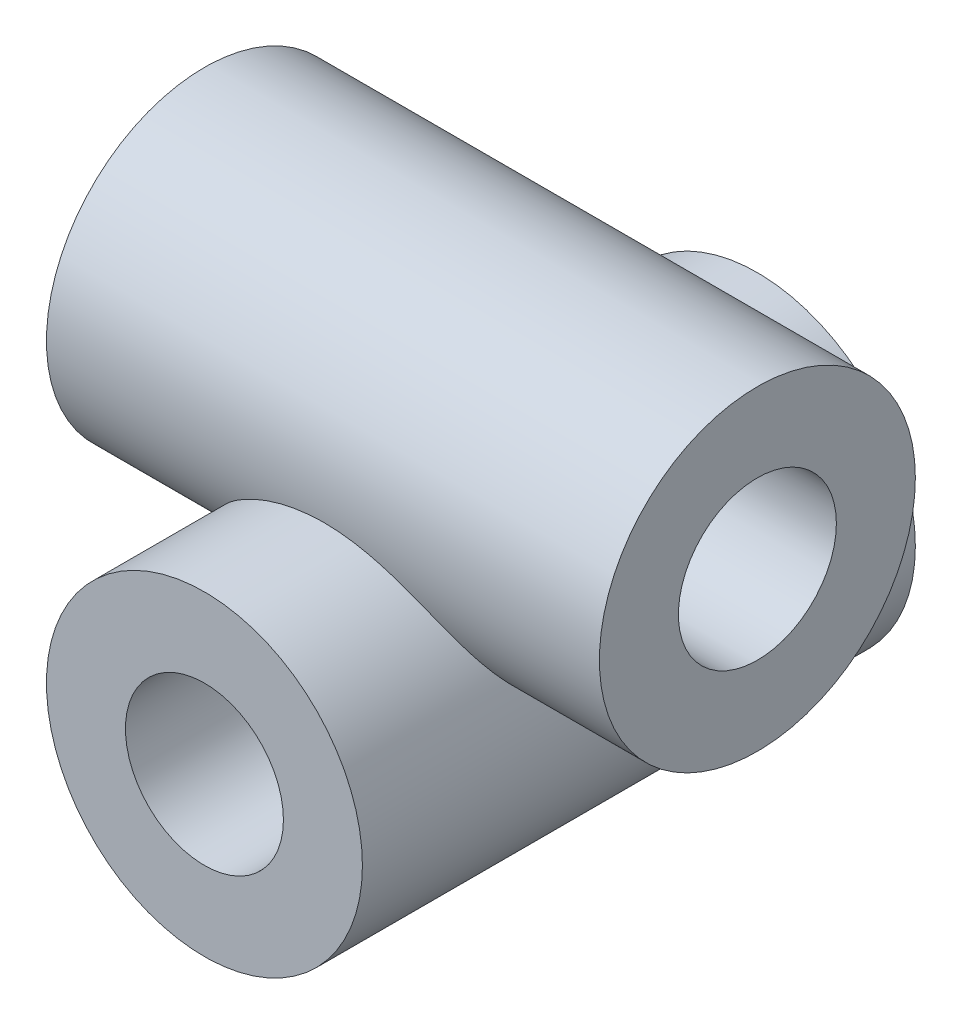
ISO-10303-21;
HEADER;
FILE_DESCRIPTION(('STEP AP214'),'2;1');
FILE_NAME('part.step','',(''),(''),'','','');
FILE_SCHEMA(('AUTOMOTIVE_DESIGN { 1 0 10303 214 1 1 1 1 }'));
ENDSEC;
DATA;
#1=APPLICATION_CONTEXT('core data for automotive mechanical design processes');
#2=APPLICATION_PROTOCOL_DEFINITION('international standard','automotive_design',2000,#1);
#3=PRODUCT_CONTEXT('',#1,'mechanical');
#4=PRODUCT('Part','Part','',(#3));
#5=PRODUCT_RELATED_PRODUCT_CATEGORY('part','',(#4));
#6=PRODUCT_DEFINITION_FORMATION('','',#4);
#7=PRODUCT_DEFINITION_CONTEXT('part definition',#1,'design');
#8=PRODUCT_DEFINITION('design','',#6,#7);
#9=PRODUCT_DEFINITION_SHAPE('','',#8);
#10=(LENGTH_UNIT() NAMED_UNIT(*) SI_UNIT(.MILLI.,.METRE.));
#11=(NAMED_UNIT(*) PLANE_ANGLE_UNIT() SI_UNIT($,.RADIAN.));
#12=(NAMED_UNIT(*) SI_UNIT($,.STERADIAN.) SOLID_ANGLE_UNIT());
#13=UNCERTAINTY_MEASURE_WITH_UNIT(LENGTH_MEASURE(1.E-05),#10,'distance_accuracy_value','');
#14=(GEOMETRIC_REPRESENTATION_CONTEXT(3) GLOBAL_UNCERTAINTY_ASSIGNED_CONTEXT((#13)) GLOBAL_UNIT_ASSIGNED_CONTEXT((#10,
#11,#12)) REPRESENTATION_CONTEXT('',''));
#15=CARTESIAN_POINT('',(0.,0.,0.));
#16=DIRECTION('',(0.,0.,1.));
#17=DIRECTION('',(1.,0.,0.));
#18=AXIS2_PLACEMENT_3D('',#15,#16,#17);
#19=CARTESIAN_POINT('',(0.,0.,56.));
#20=DIRECTION('',(0.,0.,-1.));
#21=DIRECTION('',(-1.,0.,0.));
#22=AXIS2_PLACEMENT_3D('',#19,#20,#21);
#23=CYLINDRICAL_SURFACE('',#22,16.);
#24=CARTESIAN_POINT('',(0.,0.,56.));
#25=DIRECTION('',(0.,0.,1.));
#26=DIRECTION('',(1.,0.,0.));
#27=AXIS2_PLACEMENT_3D('',#24,#25,#26);
#28=CIRCLE('',#27,16.);
#29=CARTESIAN_POINT('',(16.,0.,56.));
#30=VERTEX_POINT('',#29);
#31=EDGE_CURVE('E41',#30,#30,#28,.T.);
#32=ORIENTED_EDGE('',*,*,#31,.F.);
#33=EDGE_LOOP('',(#32));
#34=FACE_BOUND('',#33,.T.);
#35=CARTESIAN_POINT('',(0.,0.,0.));
#36=DIRECTION('',(0.,0.,1.));
#37=DIRECTION('',(1.,0.,0.));
#38=AXIS2_PLACEMENT_3D('',#35,#36,#37);
#39=CIRCLE('',#38,16.);
#40=CARTESIAN_POINT('',(16.,0.,0.));
#41=VERTEX_POINT('',#40);
#42=EDGE_CURVE('E37',#41,#41,#39,.T.);
#43=ORIENTED_EDGE('',*,*,#42,.T.);
#44=EDGE_LOOP('',(#43));
#45=FACE_BOUND('',#44,.T.);
#46=CARTESIAN_POINT('',(0.,16.,43.8745078663875));
#47=CARTESIAN_POINT('',(0.436646655831672,15.9999981450568,43.87451060128));
#48=CARTESIAN_POINT('',(0.873339937822835,15.9821122939766,43.8722857239636));
#49=CARTESIAN_POINT('',(1.74391300438998,15.9106766574318,43.8630387172813));
#50=CARTESIAN_POINT('',(2.1777915119281,15.8571116908978,43.856014545836));
#51=CARTESIAN_POINT('',(3.04044936169511,15.7145522319213,43.8360955072419));
#52=CARTESIAN_POINT('',(3.46921688873031,15.6254877067201,43.8231890283408));
#53=CARTESIAN_POINT('',(4.31769730161077,15.4126173803366,43.7897766483459));
#54=CARTESIAN_POINT('',(4.73741114624135,15.2888152775091,43.7692715561681));
#55=CARTESIAN_POINT('',(5.56544378560812,15.0072435536613,43.7182665369156));
#56=CARTESIAN_POINT('',(5.97374298633112,14.8494191445544,43.6877504466988));
#57=CARTESIAN_POINT('',(6.77511037402526,14.5013344742994,43.6138073830064));
#58=CARTESIAN_POINT('',(7.16817794313895,14.3110728990537,43.5703798864096));
#59=CARTESIAN_POINT('',(7.93554267804045,13.9002302178081,43.4672779009519));
#60=CARTESIAN_POINT('',(8.3098543753323,13.6796730955919,43.4076162277539));
#61=CARTESIAN_POINT('',(9.03674921374844,13.2107591049879,43.2683641891569));
#62=CARTESIAN_POINT('',(9.38933416562267,12.9624045581644,43.1887754873228));
#63=CARTESIAN_POINT('',(10.0528073959647,12.4541958217915,43.0104271721849));
#64=CARTESIAN_POINT('',(10.3648937091361,12.1955087949687,42.912803576111));
#65=CARTESIAN_POINT('',(10.9638931121697,11.6599487092304,42.6931094750389));
#66=CARTESIAN_POINT('',(11.2508070558025,11.3830762676665,42.5710397996391));
#67=CARTESIAN_POINT('',(11.7969026511473,10.8160921274116,42.3000018721725));
#68=CARTESIAN_POINT('',(12.0561138447713,10.5259950121419,42.1510627385105));
#69=CARTESIAN_POINT('',(12.5454778742449,9.9376724235896,41.8243259190733));
#70=CARTESIAN_POINT('',(12.7756347102398,9.63944807613714,41.6465322136578));
#71=CARTESIAN_POINT('',(13.1788486026048,9.0786431920136,41.2855609971855));
#72=CARTESIAN_POINT('',(13.3554457428193,8.81632636237079,41.1059101284296));
#73=CARTESIAN_POINT('',(13.6859575653867,8.29397775916651,40.7239057754772));
#74=CARTESIAN_POINT('',(13.839874384211,8.03394577254711,40.5215544328174));
#75=CARTESIAN_POINT('',(14.125717575625,7.52001405601283,40.0946890115435));
#76=CARTESIAN_POINT('',(14.2576408433101,7.26611519625147,39.8701718108112));
#77=CARTESIAN_POINT('',(14.5006857862906,6.76808052288624,39.4000547092856));
#78=CARTESIAN_POINT('',(14.6118069605679,6.52394494454218,39.1544543009114));
#79=CARTESIAN_POINT('',(14.8118831139296,6.05566232416701,38.6511713286615));
#80=CARTESIAN_POINT('',(14.9013961726745,5.8311377650922,38.3940604216902));
#81=CARTESIAN_POINT('',(15.0641495812513,5.39677689764267,37.8628837714219));
#82=CARTESIAN_POINT('',(15.1373904501377,5.18694012089956,37.5888185692939));
#83=CARTESIAN_POINT('',(15.2695378271367,4.78395315664064,37.0253051877943));
#84=CARTESIAN_POINT('',(15.3284406316533,4.59080728876506,36.7358530573741));
#85=CARTESIAN_POINT('',(15.4338453926477,4.22291828910071,36.1433199984377));
#86=CARTESIAN_POINT('',(15.4803465352645,4.0481763655289,35.8402381769952));
#87=CARTESIAN_POINT('',(15.5672264116919,3.70092325091184,35.1893328565796));
#88=CARTESIAN_POINT('',(15.6064314935216,3.5306173008468,34.8401748454151));
#89=CARTESIAN_POINT('',(15.6743802502868,3.21555321689966,34.1295383598659));
#90=CARTESIAN_POINT('',(15.7031233441342,3.07079650232343,33.7680592023496));
#91=CARTESIAN_POINT('',(15.7522682173134,2.80783783958764,33.0348723863692));
#92=CARTESIAN_POINT('',(15.772666915627,2.6896457071672,32.663161003809));
#93=CARTESIAN_POINT('',(15.8068816499578,2.48066495985011,31.9118174587815));
#94=CARTESIAN_POINT('',(15.8206974114626,2.38987748780168,31.5321849666883));
#95=CARTESIAN_POINT('',(15.8443302515743,2.22814155118249,30.7266463728995));
#96=CARTESIAN_POINT('',(15.8535695102535,2.16030891990455,30.300094537067));
#97=CARTESIAN_POINT('',(15.8670004017268,2.05934088338785,29.4428109357382));
#98=CARTESIAN_POINT('',(15.8711916969471,2.02620779864045,29.0120788926393));
#99=CARTESIAN_POINT('',(15.8751612156748,1.99487125428519,28.1492199781481));
#100=CARTESIAN_POINT('',(15.8749383868864,1.99667612363507,27.7170927987142));
#101=CARTESIAN_POINT('',(15.8700420911309,2.03522348456923,26.8544264208297));
#102=CARTESIAN_POINT('',(15.8653686070605,2.07196611041473,26.423887228488));
#103=CARTESIAN_POINT('',(15.850634357518,2.18187449232417,25.5534823815164));
#104=CARTESIAN_POINT('',(15.8404051578899,2.25617370039567,25.1137621259894));
#105=CARTESIAN_POINT('',(15.8129535360227,2.44115356050731,24.2422421343094));
#106=CARTESIAN_POINT('',(15.7957308601555,2.55183553199012,23.8104426860088));
#107=CARTESIAN_POINT('',(15.752081756531,2.80871660515413,22.9578600325911));
#108=CARTESIAN_POINT('',(15.7256525752656,2.9549263286164,22.5370801637675));
#109=CARTESIAN_POINT('',(15.6607530142861,3.28154255805836,21.7099535864809));
#110=CARTESIAN_POINT('',(15.6222829727171,3.46194810365623,21.3036064730577));
#111=CARTESIAN_POINT('',(15.5306812806288,3.85193116776029,20.5151901004929));
#112=CARTESIAN_POINT('',(15.4777995604427,4.06098365419844,20.1328325731022));
#113=CARTESIAN_POINT('',(15.3535321211969,4.5080878674766,19.3885703137686));
#114=CARTESIAN_POINT('',(15.2821463161611,4.74613972905453,19.026665676866));
#115=CARTESIAN_POINT('',(15.1172054003376,5.24782922147056,18.3269848322751));
#116=CARTESIAN_POINT('',(15.0236751587111,5.51143795612907,17.989182106943));
#117=CARTESIAN_POINT('',(14.8107487117206,6.06038784683204,17.3404452445631));
#118=CARTESIAN_POINT('',(14.6913563963013,6.34572573038905,17.0295070766141));
#119=CARTESIAN_POINT('',(14.4368736173931,6.90369913680767,16.4668699084627));
#120=CARTESIAN_POINT('',(14.3045418358133,7.17475718224196,16.2123560014215));
#121=CARTESIAN_POINT('',(14.0144942201527,7.72598766105747,15.7289359733934));
#122=CARTESIAN_POINT('',(13.8567802869932,8.00615941064196,15.5000279369047));
#123=CARTESIAN_POINT('',(13.5149368635793,8.57060445599358,15.0689300452658));
#124=CARTESIAN_POINT('',(13.330822494285,8.85487532071525,14.8667250223398));
#125=CARTESIAN_POINT('',(12.9357886954146,9.42257353409345,14.4891165009158));
#126=CARTESIAN_POINT('',(12.7248710100599,9.706000936411,14.3137112600605));
#127=CARTESIAN_POINT('',(12.3009196268937,10.2366991468104,14.0066152942495));
#128=CARTESIAN_POINT('',(12.0905659062241,10.4845735358829,13.8722503978899));
#129=CARTESIAN_POINT('',(11.649774355007,10.9722725577425,13.6234223085142));
#130=CARTESIAN_POINT('',(11.4193382487188,11.2120978791726,13.5089574094209));
#131=CARTESIAN_POINT('',(10.9395032447552,11.6807439515022,13.2985366216907));
#132=CARTESIAN_POINT('',(10.6900994787266,11.9095618524014,13.202585507417));
#133=CARTESIAN_POINT('',(10.1738162948547,12.3535174780338,13.0275523295445));
#134=CARTESIAN_POINT('',(9.90693591168228,12.5686544457983,12.9484711987961));
#135=CARTESIAN_POINT('',(9.34735179378671,12.9905427288822,12.8027321199512));
#136=CARTESIAN_POINT('',(9.05406293983352,13.1967083949333,12.73662764678));
#137=CARTESIAN_POINT('',(8.45231241138395,13.589982741951,12.6183900592343));
#138=CARTESIAN_POINT('',(8.14385056416605,13.7770912059058,12.5662571039479));
#139=CARTESIAN_POINT('',(7.51352680005699,14.1307308891964,12.4738227287313));
#140=CARTESIAN_POINT('',(7.1916605122006,14.2972553250627,12.4335252031803));
#141=CARTESIAN_POINT('',(6.53647473365452,14.6084240939546,12.3627792545478));
#142=CARTESIAN_POINT('',(6.20315455680483,14.7530671133316,12.3323314226668));
#143=CARTESIAN_POINT('',(5.48509900982256,15.0359700900744,12.276201084786));
#144=CARTESIAN_POINT('',(5.0990982777922,15.1712348834967,12.251571705792));
#145=CARTESIAN_POINT('',(4.31747733994313,15.4118994169711,12.2102361139622));
#146=CARTESIAN_POINT('',(3.92185647226948,15.5172970958498,12.1935304479));
#147=CARTESIAN_POINT('',(3.12338265219243,15.6975167861793,12.166273695836));
#148=CARTESIAN_POINT('',(2.72052761981208,15.7723298520568,12.1557244101046));
#149=CARTESIAN_POINT('',(1.91017133944952,15.8908447700439,12.1395133980522));
#150=CARTESIAN_POINT('',(1.50266997757427,15.9345458578487,12.1338517918024));
#151=CARTESIAN_POINT('',(0.654509941989936,15.9926765893595,12.1263861856574));
#152=CARTESIAN_POINT('',(0.213677290581165,16.0046388897207,12.1249067904372));
#153=CARTESIAN_POINT('',(-0.667479838106356,15.992143186763,12.126483062672));
#154=CARTESIAN_POINT('',(-1.10780428574805,15.9676831571439,12.1295389824423));
#155=CARTESIAN_POINT('',(-1.98501768638697,15.8825044759494,12.1406791506835));
#156=CARTESIAN_POINT('',(-2.4219054799282,15.8217740778603,12.1487650281906));
#157=CARTESIAN_POINT('',(-3.28902589454549,15.664496943588,12.1711741967825));
#158=CARTESIAN_POINT('',(-3.71925855161752,15.567950401196,12.1854974541185));
#159=CARTESIAN_POINT('',(-4.57458435701518,15.3385568770787,12.2224729596714));
#160=CARTESIAN_POINT('',(-4.99957164918223,15.2053287157411,12.2452135831571));
#161=CARTESIAN_POINT('',(-5.83635931918789,14.9041814105971,12.3016128241833));
#162=CARTESIAN_POINT('',(-6.24815935383457,14.7362613647974,12.3352717256133));
#163=CARTESIAN_POINT('',(-7.05518903440648,14.3673624951188,12.4166883976125));
#164=CARTESIAN_POINT('',(-7.45042100114651,14.1663883209309,12.4644441859367));
#165=CARTESIAN_POINT('',(-8.22096182742892,13.733571540122,12.5776917118644));
#166=CARTESIAN_POINT('',(-8.59627204766777,13.5017310455388,12.6431822362796));
#167=CARTESIAN_POINT('',(-9.30710171218765,13.0212703144643,12.792350879858));
#168=CARTESIAN_POINT('',(-9.64365284388474,12.7738816552664,12.8750734562981));
#169=CARTESIAN_POINT('',(-10.2925358155617,12.2570668233264,13.0636572967153));
#170=CARTESIAN_POINT('',(-10.6048683343236,11.9876412686539,13.1695179118781));
#171=CARTESIAN_POINT('',(-11.2022004482436,11.4314054970644,13.4073684529354));
#172=CARTESIAN_POINT('',(-11.487235462978,11.1446186183924,13.5393238189204));
#173=CARTESIAN_POINT('',(-12.0281544207851,10.5585249015123,13.8320210450163));
#174=CARTESIAN_POINT('',(-12.2840429145775,10.2592200277746,13.9927584012152));
#175=CARTESIAN_POINT('',(-12.7350929307813,9.69184872254098,14.3227024031453));
#176=CARTESIAN_POINT('',(-12.9338471474307,9.42455304081407,14.4883400761428));
#177=CARTESIAN_POINT('',(-13.307508954996,8.88913664519337,14.8434311208173));
#178=CARTESIAN_POINT('',(-13.4824187454324,8.62101600973346,15.0328822927237));
#179=CARTESIAN_POINT('',(-13.8086346524407,8.08821510469549,15.4354464771453));
#180=CARTESIAN_POINT('',(-13.9599404898363,7.82353487584285,15.6485597694736));
#181=CARTESIAN_POINT('',(-14.2398281164356,7.30171059570131,16.0976853999613));
#182=CARTESIAN_POINT('',(-14.3684098543635,7.04456656141858,16.3336977897896));
#183=CARTESIAN_POINT('',(-14.5974461084125,6.55614823229788,16.8130215965055));
#184=CARTESIAN_POINT('',(-14.6990990478275,6.32423840354211,17.0551167908043));
#185=CARTESIAN_POINT('',(-14.8850771334924,5.87315966639124,17.5571263993029));
#186=CARTESIAN_POINT('',(-14.9694031740029,5.6539901008758,17.8170398929564));
#187=CARTESIAN_POINT('',(-15.1225340201443,5.23064659108243,18.3532216842114));
#188=CARTESIAN_POINT('',(-15.1913350549857,5.02647629800537,18.6294939345824));
#189=CARTESIAN_POINT('',(-15.3152904462865,4.63508674994955,19.196713425285));
#190=CARTESIAN_POINT('',(-15.3704439084643,4.4478686063001,19.4876616257815));
#191=CARTESIAN_POINT('',(-15.4734326243404,4.07595441761337,20.1092696471029));
#192=CARTESIAN_POINT('',(-15.5201668855584,3.89299261415764,20.4411500390047));
#193=CARTESIAN_POINT('',(-15.6020560090313,3.5506114931177,21.1182040744349));
#194=CARTESIAN_POINT('',(-15.6372103500493,3.39119323545665,21.4633783155669));
#195=CARTESIAN_POINT('',(-15.6981169844818,3.09704696114638,22.1650400019136));
#196=CARTESIAN_POINT('',(-15.7238657075505,2.96232833005045,22.5215316875023));
#197=CARTESIAN_POINT('',(-15.7678388737732,2.7185644309802,23.2436387470133));
#198=CARTESIAN_POINT('',(-15.78606295233,2.60952040714702,23.6092545621241));
#199=CARTESIAN_POINT('',(-15.8183308279758,2.40669627332995,24.3903010154513));
#200=CARTESIAN_POINT('',(-15.8316473604171,2.31614022529892,24.8066023672372));
#201=CARTESIAN_POINT('',(-15.8525447283487,2.16849707172676,25.645252563975));
#202=CARTESIAN_POINT('',(-15.860125163586,2.1114123018049,26.067601828843));
#203=CARTESIAN_POINT('',(-15.8706101893124,2.03110311371539,26.915665508904));
#204=CARTESIAN_POINT('',(-15.873513698082,2.00788652898867,27.3413806797192));
#205=CARTESIAN_POINT('',(-15.875075613052,1.99549663441731,28.1933118816999));
#206=CARTESIAN_POINT('',(-15.873733980635,2.0063236342638,28.6195279173863));
#207=CARTESIAN_POINT('',(-15.8664476499879,2.06318167692007,29.4885191007732));
#208=CARTESIAN_POINT('',(-15.8603020076335,2.11074842398909,29.9311929717509));
#209=CARTESIAN_POINT('',(-15.8421991201439,2.24257470265513,30.8109418717657));
#210=CARTESIAN_POINT('',(-15.8302416314775,2.32683577182302,31.2480166653994));
#211=CARTESIAN_POINT('',(-15.7988149816324,2.53143323792076,32.1135450548515));
#212=CARTESIAN_POINT('',(-15.7793430743765,2.65178281948626,32.5419954386613));
#213=CARTESIAN_POINT('',(-15.7305138887982,2.92754636635087,33.3868910657287));
#214=CARTESIAN_POINT('',(-15.7011567889229,3.08295969866384,33.8033365255514));
#215=CARTESIAN_POINT('',(-15.6298271324997,3.42622214745243,34.6180826587344));
#216=CARTESIAN_POINT('',(-15.5879445510947,3.6138359911697,35.0164901555992));
#217=CARTESIAN_POINT('',(-15.4880841388875,4.02032675686084,35.7949674699694));
#218=CARTESIAN_POINT('',(-15.4301060827878,4.23920411642704,36.1750370307007));
#219=CARTESIAN_POINT('',(-15.2943743757994,4.70542000332215,36.9131646347028));
#220=CARTESIAN_POINT('',(-15.2166375784129,4.95273417709949,37.2712411156972));
#221=CARTESIAN_POINT('',(-15.0375237460759,5.47251031021859,37.962372182099));
#222=CARTESIAN_POINT('',(-14.936149743126,5.74496904150215,38.2954299694752));
#223=CARTESIAN_POINT('',(-14.7156996938472,6.28700824990399,38.9068137446888));
#224=CARTESIAN_POINT('',(-14.5988010076492,6.55493871481398,39.1873878540123));
#225=CARTESIAN_POINT('',(-14.3396511163952,7.10397737289489,39.7227838963481));
#226=CARTESIAN_POINT('',(-14.1974015090548,7.38508473478327,39.9776074506773));
#227=CARTESIAN_POINT('',(-13.885882904895,7.95535647979188,40.4597130009644));
#228=CARTESIAN_POINT('',(-13.7166371048022,8.24451377143069,40.6870183498836));
#229=CARTESIAN_POINT('',(-13.3500569678422,8.82575488590907,41.1134713997988));
#230=CARTESIAN_POINT('',(-13.1527254117055,9.11783841636771,41.3126218844811));
#231=CARTESIAN_POINT('',(-12.7554545969231,9.66428271583181,41.6604452816899));
#232=CARTESIAN_POINT('',(-12.5587038776436,9.91894208024667,41.8123094658388));
#233=CARTESIAN_POINT('',(-12.1439693478095,10.4225902003746,42.0949008692633));
#234=CARTESIAN_POINT('',(-11.9259875140356,10.6715794813579,42.2256300533618));
#235=CARTESIAN_POINT('',(-11.4697113195584,11.1605362222196,42.4670703175621));
#236=CARTESIAN_POINT('',(-11.2314137634853,11.400502254286,42.5777782400297));
#237=CARTESIAN_POINT('',(-10.7358398187783,11.8683561202445,42.7806623337749));
#238=CARTESIAN_POINT('',(-10.4785626157445,12.0962434351276,42.8728377092042));
#239=CARTESIAN_POINT('',(-9.94465743393545,12.5389364756967,43.0410531706405));
#240=CARTESIAN_POINT('',(-9.6679025627773,12.753635253112,43.116971293908));
#241=CARTESIAN_POINT('',(-9.09844449120506,13.1659368546495,43.2538201596297));
#242=CARTESIAN_POINT('',(-8.80574131244119,13.3635397019787,43.314750922429));
#243=CARTESIAN_POINT('',(-8.2059543829789,13.740006369344,43.4237120769396));
#244=CARTESIAN_POINT('',(-7.89886080811711,13.9188571096996,43.4717335003633));
#245=CARTESIAN_POINT('',(-7.27226488576006,14.2562550494877,43.5568199670567));
#246=CARTESIAN_POINT('',(-6.95276203702778,14.41480142767,43.5938845672351));
#247=CARTESIAN_POINT('',(-6.26415393144148,14.728207279462,43.6628268227692));
#248=CARTESIAN_POINT('',(-5.8936931662565,14.8803475228165,43.6935504290752));
#249=CARTESIAN_POINT('',(-5.14179808513323,15.156595278567,43.7459462089044));
#250=CARTESIAN_POINT('',(-4.76036199983436,15.2806982421292,43.7676169141475));
#251=CARTESIAN_POINT('',(-3.98942888115777,15.4998339133845,43.8038441770183));
#252=CARTESIAN_POINT('',(-3.59994260468994,15.5949030351939,43.8184096598011));
#253=CARTESIAN_POINT('',(-2.81490308704768,15.7555316472356,43.842000039879));
#254=CARTESIAN_POINT('',(-2.41935202773844,15.8211015039534,43.8510268839415));
#255=CARTESIAN_POINT('',(-1.68672773573456,15.914431358938,43.8635501642189));
#256=CARTESIAN_POINT('',(-1.35020815305262,15.9465072636627,43.8676917440905));
#257=CARTESIAN_POINT('',(-0.675801675348916,15.9892921497695,43.8731695169463));
#258=CARTESIAN_POINT('',(-0.337914799872669,16.0000014355149,43.8745057498921));
#259=CARTESIAN_POINT('',(0.,16.,43.8745078663875));
#260=B_SPLINE_CURVE_WITH_KNOTS('',3,(#46,#47,#48,#49,#50,#51,#52,#53,#54,#55,#56,#57,#58,#59,
#60,#61,#62,#63,#64,#65,#66,#67,#68,#69,#70,#71,#72,#73,#74,#75,#76,#77,#78,#79,#80,#81,#82,#83,
#84,#85,#86,#87,#88,#89,#90,#91,#92,#93,#94,#95,#96,#97,#98,#99,#100,#101,#102,#103,#104,#105,
#106,#107,#108,#109,#110,#111,#112,#113,#114,#115,#116,#117,#118,#119,#120,#121,#122,#123,#124,
#125,#126,#127,#128,#129,#130,#131,#132,#133,#134,#135,#136,#137,#138,#139,#140,#141,#142,#143,
#144,#145,#146,#147,#148,#149,#150,#151,#152,#153,#154,#155,#156,#157,#158,#159,#160,#161,#162,
#163,#164,#165,#166,#167,#168,#169,#170,#171,#172,#173,#174,#175,#176,#177,#178,#179,#180,#181,
#182,#183,#184,#185,#186,#187,#188,#189,#190,#191,#192,#193,#194,#195,#196,#197,#198,#199,#200,
#201,#202,#203,#204,#205,#206,#207,#208,#209,#210,#211,#212,#213,#214,#215,#216,#217,#218,#219,
#220,#221,#222,#223,#224,#225,#226,#227,#228,#229,#230,#231,#232,#233,#234,#235,#236,#237,#238,
#239,#240,#241,#242,#243,#244,#245,#246,#247,#248,#249,#250,#251,#252,#253,#254,#255,#256,#257,
#258,#259),.UNSPECIFIED.,.T.,.F.,(4,2,2,2,2,2,2,2,2,2,2,2,2,2,2,2,2,2,2,2,2,2,2,2,2,2,2,2,2,2,2,
2,2,2,2,2,2,2,2,2,2,2,2,2,2,2,2,2,2,2,2,2,2,2,2,2,2,2,2,2,2,2,2,2,2,2,2,2,2,2,2,2,2,2,2,2,2,2,2,
2,2,2,2,2,2,2,2,2,2,2,2,2,2,2,2,2,2,2,2,2,2,2,2,2,2,2,4),(0.,1.30964894631869,2.61985549005877,
3.93265967639963,5.24532414733715,6.56011848279083,7.87496609598381,9.18877873211194,
10.5024817239902,11.751543095352,13.00056208594,14.2482355590821,15.4957370672791,
16.5854174595803,17.674995138999,18.7647265077995,19.8544841193858,20.9120324155339,
21.9695469728891,23.0273344025383,24.0851912325888,25.2553257856956,26.4255253214303,
27.5961565431699,28.7668365766448,30.0613932647291,31.3560365192418,32.6509884112233,
33.9459452795555,35.2825512219024,36.6192056424115,37.9562601770893,39.2932771664599,
40.6084398810986,41.9236087065249,43.2373074882833,44.5508088121072,45.7331278727098,
46.9153584281845,48.0969145409683,49.2783938035126,50.3324889892842,51.386493760198,
52.4407699772694,53.4951044769872,54.5876131260433,55.6801342145327,56.7730143890148,
57.8659601484253,59.0939035067502,60.3219315866197,61.5503185910591,62.7787357713186,
64.1001806323347,65.4216990126481,66.7436456118778,68.0655850585244,69.4018167538122,
70.7380831956632,72.0741618267693,73.4101490832052,74.6857683541999,75.9613518601127,
77.2352571617802,78.5089632919761,79.6234878259548,80.7379094813553,81.8523443166007,
82.9667816664848,84.0166159377339,85.0663960122456,86.1164307887045,87.1665343523598,
88.3108797515073,89.4552766530372,90.6001075140561,91.7449938399219,93.0222957410719,
94.2996867614961,95.5773731854507,96.8550712324267,98.1892747835834,99.5235342461132,
100.858281764294,102.193005188957,103.518362143181,104.843737650113,106.167986430655,
107.492065440012,108.705873287385,109.919604662819,111.132298691467,112.344872736438,
113.411114029654,114.477256142296,115.543566254166,116.609922147109,117.684017476731,
118.758111348279,119.832949489822,120.907831091611,122.111537021304,123.315438103047,
124.51782299703,125.719785024189,126.733318644234,127.746837826594),.UNSPECIFIED.);
#261=CARTESIAN_POINT('',(0.,16.,43.8745078663875));
#262=VERTEX_POINT('',#261);
#263=EDGE_CURVE('E10',#262,#262,#260,.T.);
#264=ORIENTED_EDGE('',*,*,#263,.F.);
#265=EDGE_LOOP('',(#264));
#266=FACE_BOUND('',#265,.T.);
#267=ADVANCED_FACE('F33',(#34,#45,#266),#23,.T.);
#268=CARTESIAN_POINT('',(0.,0.,56.));
#269=DIRECTION('',(0.,0.,-1.));
#270=DIRECTION('',(-1.,0.,0.));
#271=AXIS2_PLACEMENT_3D('',#268,#269,#270);
#272=CYLINDRICAL_SURFACE('',#271,8.);
#273=CARTESIAN_POINT('',(0.,0.,0.));
#274=DIRECTION('',(0.,0.,1.));
#275=DIRECTION('',(1.,0.,0.));
#276=AXIS2_PLACEMENT_3D('',#273,#274,#275);
#277=CIRCLE('',#276,8.);
#278=CARTESIAN_POINT('',(8.,0.,0.));
#279=VERTEX_POINT('',#278);
#280=EDGE_CURVE('E92',#279,#279,#277,.T.);
#281=ORIENTED_EDGE('',*,*,#280,.F.);
#282=EDGE_LOOP('',(#281));
#283=FACE_BOUND('',#282,.T.);
#284=CARTESIAN_POINT('',(0.,0.,56.));
#285=DIRECTION('',(0.,0.,1.));
#286=DIRECTION('',(1.,0.,0.));
#287=AXIS2_PLACEMENT_3D('',#284,#285,#286);
#288=CIRCLE('',#287,8.);
#289=CARTESIAN_POINT('',(8.,0.,56.));
#290=VERTEX_POINT('',#289);
#291=EDGE_CURVE('E54',#290,#290,#288,.T.);
#292=ORIENTED_EDGE('',*,*,#291,.T.);
#293=EDGE_LOOP('',(#292));
#294=FACE_BOUND('',#293,.T.);
#295=ADVANCED_FACE('F70',(#283,#294),#272,.F.);
#296=CARTESIAN_POINT('',(0.,0.,56.));
#297=DIRECTION('',(0.,0.,1.));
#298=DIRECTION('',(1.,0.,0.));
#299=AXIS2_PLACEMENT_3D('',#296,#297,#298);
#300=PLANE('',#299);
#301=ORIENTED_EDGE('',*,*,#31,.T.);
#302=EDGE_LOOP('',(#301));
#303=FACE_BOUND('',#302,.T.);
#304=ORIENTED_EDGE('',*,*,#291,.F.);
#305=EDGE_LOOP('',(#304));
#306=FACE_BOUND('',#305,.T.);
#307=ADVANCED_FACE('F73',(#303,#306),#300,.T.);
#308=CARTESIAN_POINT('',(0.,0.,0.));
#309=DIRECTION('',(0.,0.,1.));
#310=DIRECTION('',(1.,0.,0.));
#311=AXIS2_PLACEMENT_3D('',#308,#309,#310);
#312=PLANE('',#311);
#313=ORIENTED_EDGE('',*,*,#42,.F.);
#314=EDGE_LOOP('',(#313));
#315=FACE_BOUND('',#314,.T.);
#316=ORIENTED_EDGE('',*,*,#280,.T.);
#317=EDGE_LOOP('',(#316));
#318=FACE_BOUND('',#317,.T.);
#319=ADVANCED_FACE('F68',(#315,#318),#312,.F.);
#320=CARTESIAN_POINT('',(28.,18.,28.));
#321=DIRECTION('',(-1.,0.,0.));
#322=DIRECTION('',(0.,0.,1.));
#323=AXIS2_PLACEMENT_3D('',#320,#321,#322);
#324=CYLINDRICAL_SURFACE('',#323,8.);
#325=CARTESIAN_POINT('',(28.,18.,28.));
#326=DIRECTION('',(1.,0.,0.));
#327=DIRECTION('',(0.,0.,-1.));
#328=AXIS2_PLACEMENT_3D('',#325,#326,#327);
#329=CIRCLE('',#328,8.);
#330=CARTESIAN_POINT('',(28.,18.,20.));
#331=VERTEX_POINT('',#330);
#332=EDGE_CURVE('E99',#331,#331,#329,.T.);
#333=ORIENTED_EDGE('',*,*,#332,.T.);
#334=EDGE_LOOP('',(#333));
#335=FACE_BOUND('',#334,.T.);
#336=CARTESIAN_POINT('',(-28.,18.,28.));
#337=DIRECTION('',(1.,0.,0.));
#338=DIRECTION('',(0.,0.,-1.));
#339=AXIS2_PLACEMENT_3D('',#336,#337,#338);
#340=CIRCLE('',#339,8.);
#341=CARTESIAN_POINT('',(-28.,18.,20.));
#342=VERTEX_POINT('',#341);
#343=EDGE_CURVE('E105',#342,#342,#340,.T.);
#344=ORIENTED_EDGE('',*,*,#343,.F.);
#345=EDGE_LOOP('',(#344));
#346=FACE_BOUND('',#345,.T.);
#347=ADVANCED_FACE('F62',(#335,#346),#324,.F.);
#348=CARTESIAN_POINT('',(28.,18.,28.));
#349=DIRECTION('',(-1.,0.,0.));
#350=DIRECTION('',(0.,0.,1.));
#351=AXIS2_PLACEMENT_3D('',#348,#349,#350);
#352=CYLINDRICAL_SURFACE('',#351,16.);
#353=CARTESIAN_POINT('',(28.,18.,28.));
#354=DIRECTION('',(1.,0.,0.));
#355=DIRECTION('',(0.,0.,-1.));
#356=AXIS2_PLACEMENT_3D('',#353,#354,#355);
#357=CIRCLE('',#356,16.);
#358=CARTESIAN_POINT('',(28.,18.,12.));
#359=VERTEX_POINT('',#358);
#360=EDGE_CURVE('E96',#359,#359,#357,.T.);
#361=ORIENTED_EDGE('',*,*,#360,.F.);
#362=EDGE_LOOP('',(#361));
#363=FACE_BOUND('',#362,.T.);
#364=CARTESIAN_POINT('',(-28.,18.,28.));
#365=DIRECTION('',(1.,0.,0.));
#366=DIRECTION('',(0.,0.,-1.));
#367=AXIS2_PLACEMENT_3D('',#364,#365,#366);
#368=CIRCLE('',#367,16.);
#369=CARTESIAN_POINT('',(-28.,18.,12.));
#370=VERTEX_POINT('',#369);
#371=EDGE_CURVE('E52',#370,#370,#368,.T.);
#372=ORIENTED_EDGE('',*,*,#371,.T.);
#373=EDGE_LOOP('',(#372));
#374=FACE_BOUND('',#373,.T.);
#375=ORIENTED_EDGE('',*,*,#263,.T.);
#376=EDGE_LOOP('',(#375));
#377=FACE_BOUND('',#376,.T.);
#378=ADVANCED_FACE('F56',(#363,#374,#377),#352,.T.);
#379=CARTESIAN_POINT('',(28.,0.,0.));
#380=DIRECTION('',(1.,0.,0.));
#381=DIRECTION('',(0.,0.,-1.));
#382=AXIS2_PLACEMENT_3D('',#379,#380,#381);
#383=PLANE('',#382);
#384=ORIENTED_EDGE('',*,*,#332,.F.);
#385=EDGE_LOOP('',(#384));
#386=FACE_BOUND('',#385,.T.);
#387=ORIENTED_EDGE('',*,*,#360,.T.);
#388=EDGE_LOOP('',(#387));
#389=FACE_BOUND('',#388,.T.);
#390=ADVANCED_FACE('F61',(#386,#389),#383,.T.);
#391=CARTESIAN_POINT('',(-28.,0.,0.));
#392=DIRECTION('',(1.,0.,0.));
#393=DIRECTION('',(0.,0.,-1.));
#394=AXIS2_PLACEMENT_3D('',#391,#392,#393);
#395=PLANE('',#394);
#396=ORIENTED_EDGE('',*,*,#343,.T.);
#397=EDGE_LOOP('',(#396));
#398=FACE_BOUND('',#397,.T.);
#399=ORIENTED_EDGE('',*,*,#371,.F.);
#400=EDGE_LOOP('',(#399));
#401=FACE_BOUND('',#400,.T.);
#402=ADVANCED_FACE('F64',(#398,#401),#395,.F.);
#403=CLOSED_SHELL('',(#267,#295,#307,#319,#347,#378,#390,#402));
#404=MANIFOLD_SOLID_BREP('B2',#403);
#405=ADVANCED_BREP_SHAPE_REPRESENTATION('',(#18,#404),#14);
#406=SHAPE_DEFINITION_REPRESENTATION(#9,#405);
ENDSEC;
END-ISO-10303-21;
